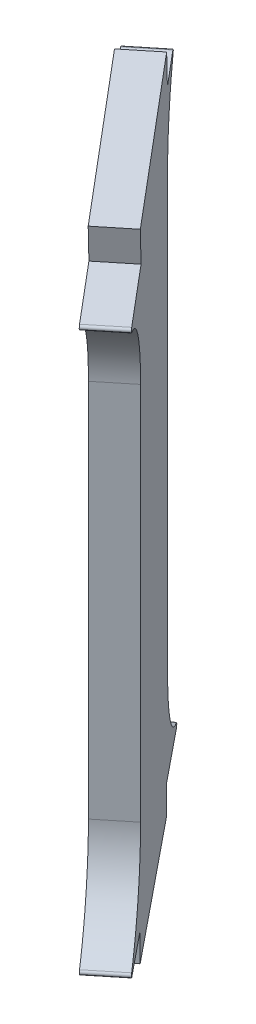
ISO-10303-21;
HEADER;
FILE_DESCRIPTION(('STEP AP214'),'2;1');
FILE_NAME('part.step','',(''),(''),'','','');
FILE_SCHEMA(('AUTOMOTIVE_DESIGN { 1 0 10303 214 1 1 1 1 }'));
ENDSEC;
DATA;
#1=APPLICATION_CONTEXT('core data for automotive mechanical design processes');
#2=APPLICATION_PROTOCOL_DEFINITION('international standard','automotive_design',2000,#1);
#3=PRODUCT_CONTEXT('',#1,'mechanical');
#4=PRODUCT('Part','Part','',(#3));
#5=PRODUCT_RELATED_PRODUCT_CATEGORY('part','',(#4));
#6=PRODUCT_DEFINITION_FORMATION('','',#4);
#7=PRODUCT_DEFINITION_CONTEXT('part definition',#1,'design');
#8=PRODUCT_DEFINITION('design','',#6,#7);
#9=PRODUCT_DEFINITION_SHAPE('','',#8);
#10=(LENGTH_UNIT() NAMED_UNIT(*) SI_UNIT(.MILLI.,.METRE.));
#11=(NAMED_UNIT(*) PLANE_ANGLE_UNIT() SI_UNIT($,.RADIAN.));
#12=(NAMED_UNIT(*) SI_UNIT($,.STERADIAN.) SOLID_ANGLE_UNIT());
#13=UNCERTAINTY_MEASURE_WITH_UNIT(LENGTH_MEASURE(1.E-05),#10,'distance_accuracy_value','');
#14=(GEOMETRIC_REPRESENTATION_CONTEXT(3) GLOBAL_UNCERTAINTY_ASSIGNED_CONTEXT((#13)) GLOBAL_UNIT_ASSIGNED_CONTEXT((#10,
#11,#12)) REPRESENTATION_CONTEXT('',''));
#15=CARTESIAN_POINT('',(0.,0.,0.));
#16=DIRECTION('',(0.,0.,1.));
#17=DIRECTION('',(1.,0.,0.));
#18=AXIS2_PLACEMENT_3D('',#15,#16,#17);
#19=CARTESIAN_POINT('',(-103.294328172004,60.7540029787998,-26.7976457365978));
#20=DIRECTION('',(-0.776187884580817,0.,0.630501679482264));
#21=DIRECTION('',(0.,1.,0.));
#22=AXIS2_PLACEMENT_3D('',#19,#20,#21);
#23=ELLIPSE('',#22,10.0702795953244,10.);
#24=DIRECTION('',(-0.776187884580817,0.,0.630501679482264));
#25=VECTOR('',#24,1.);
#26=SURFACE_OF_LINEAR_EXTRUSION('',#23,#25);
#27=CARTESIAN_POINT('',(-106.399079710327,60.7540029787998,-24.2756390186688));
#28=DIRECTION('',(-0.776187884580817,0.,0.630501679482264));
#29=DIRECTION('',(0.,1.,0.));
#30=AXIS2_PLACEMENT_3D('',#27,#28,#29);
#31=ELLIPSE('',#30,10.0702795953244,10.);
#32=CARTESIAN_POINT('',(-100.094062915505,60.754002978797,-16.5137601728606));
#33=VERTEX_POINT('',#32);
#34=CARTESIAN_POINT('',(-102.677703872655,68.8831263557012,-19.6943874008383));
#35=VERTEX_POINT('',#34);
#36=EDGE_CURVE('E186',#33,#35,#31,.T.);
#37=ORIENTED_EDGE('',*,*,#36,.T.);
#38=DIRECTION('',(-0.776187884580817,0.,0.630501679482264));
#39=VECTOR('',#38,1.);
#40=CARTESIAN_POINT('',(-102.677703872655,68.8831263557012,-19.6943874008383));
#41=LINE('',#40,#39);
#42=CARTESIAN_POINT('',(-99.572952334332,68.8831263557012,-22.2163941187674));
#43=VERTEX_POINT('',#42);
#44=EDGE_CURVE('E45',#35,#43,#41,.F.);
#45=ORIENTED_EDGE('',*,*,#44,.T.);
#46=CARTESIAN_POINT('',(-96.9893113771815,60.754002978797,-19.0357668907898));
#47=VERTEX_POINT('',#46);
#48=EDGE_CURVE('E228',#47,#43,#23,.T.);
#49=ORIENTED_EDGE('',*,*,#48,.F.);
#50=DIRECTION('',(0.776187884580817,0.,-0.630501679482264));
#51=VECTOR('',#50,1.);
#52=CARTESIAN_POINT('',(-96.9893113771815,60.754002978797,-19.0357668907898));
#53=LINE('',#52,#51);
#54=EDGE_CURVE('E310',#33,#47,#53,.T.);
#55=ORIENTED_EDGE('',*,*,#54,.F.);
#56=EDGE_LOOP('',(#37,#45,#49,#55));
#57=FACE_BOUND('',#56,.T.);
#58=ADVANCED_FACE('F37',(#57),#26,.F.);
#59=CARTESIAN_POINT('',(-78.0742609927137,54.9056720327663,4.24986964663486));
#60=DIRECTION('',(-0.776187884580817,0.,0.630501679482264));
#61=DIRECTION('',(0.,-1.,0.));
#62=AXIS2_PLACEMENT_3D('',#59,#60,#61);
#63=ELLIPSE('',#62,10.0702795953244,10.);
#64=DIRECTION('',(-0.776187884580817,0.,0.630501679482264));
#65=VECTOR('',#64,1.);
#66=SURFACE_OF_LINEAR_EXTRUSION('',#63,#65);
#67=CARTESIAN_POINT('',(-80.1944561355512,64.3895110863629,1.63977385090458));
#68=VERTEX_POINT('',#67);
#69=CARTESIAN_POINT('',(-84.3792777875361,54.9056720327599,-3.51200919917346));
#70=VERTEX_POINT('',#69);
#71=EDGE_CURVE('E331',#68,#70,#63,.T.);
#72=ORIENTED_EDGE('',*,*,#71,.F.);
#73=DIRECTION('',(-0.776187884580817,0.,0.630501679482264));
#74=VECTOR('',#73,1.);
#75=CARTESIAN_POINT('',(-80.1944561355512,64.3895110863629,1.63977385090458));
#76=LINE('',#75,#74);
#77=CARTESIAN_POINT('',(-83.2992076738744,64.3895110863629,4.16178056883363));
#78=VERTEX_POINT('',#77);
#79=EDGE_CURVE('E194',#68,#78,#76,.T.);
#80=ORIENTED_EDGE('',*,*,#79,.T.);
#81=CARTESIAN_POINT('',(-81.179012531037,54.9056720327663,6.77187636456391));
#82=DIRECTION('',(-0.776187884580817,0.,0.630501679482264));
#83=DIRECTION('',(0.,-1.,0.));
#84=AXIS2_PLACEMENT_3D('',#81,#82,#83);
#85=ELLIPSE('',#84,10.0702795953244,10.);
#86=CARTESIAN_POINT('',(-87.4840293258596,54.9056720327599,-0.990002481244256));
#87=VERTEX_POINT('',#86);
#88=EDGE_CURVE('E329',#78,#87,#85,.T.);
#89=ORIENTED_EDGE('',*,*,#88,.T.);
#90=DIRECTION('',(0.776187884580817,0.,-0.630501679482264));
#91=VECTOR('',#90,1.);
#92=CARTESIAN_POINT('',(-84.3792777875361,54.9056720327599,-3.51200919917346));
#93=LINE('',#92,#91);
#94=EDGE_CURVE('E360',#87,#70,#93,.T.);
#95=ORIENTED_EDGE('',*,*,#94,.T.);
#96=EDGE_LOOP('',(#72,#80,#89,#95));
#97=FACE_BOUND('',#96,.T.);
#98=ADVANCED_FACE('F237',(#97),#66,.F.);
#99=CARTESIAN_POINT('',(-192.,4.1,-136.));
#100=DIRECTION('',(0.,-1.,0.));
#101=DIRECTION('',(0.630501679482264,0.,0.776187884580817));
#102=AXIS2_PLACEMENT_3D('',#99,#100,#101);
#103=PLANE('',#102);
#104=DIRECTION('',(0.630501679482264,0.,0.776187884580817));
#105=VECTOR('',#104,1.);
#106=CARTESIAN_POINT('',(-195.104751538323,4.1,-133.477993282071));
#107=LINE('',#106,#105);
#108=CARTESIAN_POINT('',(-104.220424971317,4.1,-21.5935757218777));
#109=VERTEX_POINT('',#108);
#110=CARTESIAN_POINT('',(-99.5657749961663,4.1,-15.8634039630284));
#111=VERTEX_POINT('',#110);
#112=EDGE_CURVE('E350',#109,#111,#107,.T.);
#113=ORIENTED_EDGE('',*,*,#112,.F.);
#114=DIRECTION('',(-0.776187884580817,0.,0.630501679482264));
#115=VECTOR('',#114,1.);
#116=CARTESIAN_POINT('',(-101.115673432994,4.1,-24.1155824398067));
#117=LINE('',#116,#115);
#118=CARTESIAN_POINT('',(-101.115673432994,4.1,-24.1155824398067));
#119=VERTEX_POINT('',#118);
#120=EDGE_CURVE('E274',#109,#119,#117,.F.);
#121=ORIENTED_EDGE('',*,*,#120,.T.);
#122=DIRECTION('',(0.630501679482264,0.,0.776187884580817));
#123=VECTOR('',#122,1.);
#124=CARTESIAN_POINT('',(-192.,4.1,-136.));
#125=LINE('',#124,#123);
#126=CARTESIAN_POINT('',(-96.4610234578431,4.1,-18.3854106809574));
#127=VERTEX_POINT('',#126);
#128=EDGE_CURVE('E220',#119,#127,#125,.T.);
#129=ORIENTED_EDGE('',*,*,#128,.T.);
#130=DIRECTION('',(0.776187884580817,0.,-0.630501679482264));
#131=VECTOR('',#130,1.);
#132=CARTESIAN_POINT('',(-96.4610234578431,4.1,-18.3854106809574));
#133=LINE('',#132,#131);
#134=EDGE_CURVE('E195',#111,#127,#133,.T.);
#135=ORIENTED_EDGE('',*,*,#134,.F.);
#136=EDGE_LOOP('',(#113,#121,#129,#135));
#137=FACE_BOUND('',#136,.T.);
#138=ADVANCED_FACE('F247',(#137),#103,.T.);
#139=CARTESIAN_POINT('',(-103.294328172004,14.00000000001,-26.7976457365978));
#140=DIRECTION('',(-0.776187884580817,0.,0.630501679482264));
#141=DIRECTION('',(0.630501679482264,0.,0.776187884580817));
#142=AXIS2_PLACEMENT_3D('',#139,#140,#141);
#143=CYLINDRICAL_SURFACE('',#142,10.);
#144=CARTESIAN_POINT('',(-103.294328172004,14.00000000001,-26.7976457365978));
#145=DIRECTION('',(-0.776187884580817,0.,0.630501679482264));
#146=DIRECTION('',(0.630501679482264,0.,0.776187884580817));
#147=AXIS2_PLACEMENT_3D('',#144,#145,#146);
#148=CIRCLE('',#147,10.);
#149=CARTESIAN_POINT('',(-101.168811353457,4.58536585365878,-24.1809986177772));
#150=VERTEX_POINT('',#149);
#151=CARTESIAN_POINT('',(-96.9893113771815,14.00000000001,-19.0357668907898));
#152=VERTEX_POINT('',#151);
#153=EDGE_CURVE('E222',#150,#152,#148,.T.);
#154=ORIENTED_EDGE('',*,*,#153,.F.);
#155=DIRECTION('',(-0.776187884580817,0.,0.630501679482264));
#156=VECTOR('',#155,1.);
#157=CARTESIAN_POINT('',(-101.168811353457,4.58536585365878,-24.1809986177772));
#158=LINE('',#157,#156);
#159=CARTESIAN_POINT('',(-104.273562891781,4.58536585365878,-21.6589918998482));
#160=VERTEX_POINT('',#159);
#161=EDGE_CURVE('E272',#150,#160,#158,.T.);
#162=ORIENTED_EDGE('',*,*,#161,.T.);
#163=CARTESIAN_POINT('',(-106.399079710327,14.00000000001,-24.2756390186688));
#164=DIRECTION('',(-0.776187884580817,0.,0.630501679482264));
#165=DIRECTION('',(0.630501679482264,0.,0.776187884580817));
#166=AXIS2_PLACEMENT_3D('',#163,#164,#165);
#167=CIRCLE('',#166,10.);
#168=CARTESIAN_POINT('',(-100.094062915505,14.00000000001,-16.5137601728606));
#169=VERTEX_POINT('',#168);
#170=EDGE_CURVE('E348',#160,#169,#167,.T.);
#171=ORIENTED_EDGE('',*,*,#170,.T.);
#172=DIRECTION('',(0.776187884580817,0.,-0.630501679482264));
#173=VECTOR('',#172,1.);
#174=CARTESIAN_POINT('',(-96.9893113771815,14.00000000001,-19.0357668907898));
#175=LINE('',#174,#173);
#176=EDGE_CURVE('E308',#169,#152,#175,.T.);
#177=ORIENTED_EDGE('',*,*,#176,.T.);
#178=EDGE_LOOP('',(#154,#162,#171,#177));
#179=FACE_BOUND('',#178,.T.);
#180=ADVANCED_FACE('F243',(#179),#143,.F.);
#181=CARTESIAN_POINT('',(-96.9893113771815,500000.,-19.0357668907898));
#182=DIRECTION('',(-0.630501679482264,0.,-0.776187884580817));
#183=DIRECTION('',(0.,-1.,0.));
#184=AXIS2_PLACEMENT_3D('',#181,#182,#183);
#185=PLANE('',#184);
#186=ORIENTED_EDGE('',*,*,#176,.F.);
#187=DIRECTION('',(0.,1.,0.));
#188=VECTOR('',#187,1.);
#189=CARTESIAN_POINT('',(-100.094062915505,4.,-16.5137601728606));
#190=LINE('',#189,#188);
#191=EDGE_CURVE('E311',#33,#169,#190,.F.);
#192=ORIENTED_EDGE('',*,*,#191,.F.);
#193=ORIENTED_EDGE('',*,*,#54,.T.);
#194=DIRECTION('',(0.,-1.,0.));
#195=VECTOR('',#194,1.);
#196=CARTESIAN_POINT('',(-96.9893113771815,500000.,-19.0357668907898));
#197=LINE('',#196,#195);
#198=EDGE_CURVE('E225',#47,#152,#197,.T.);
#199=ORIENTED_EDGE('',*,*,#198,.T.);
#200=EDGE_LOOP('',(#186,#192,#193,#199));
#201=FACE_BOUND('',#200,.T.);
#202=ADVANCED_FACE('F240',(#201),#185,.T.);
#203=CARTESIAN_POINT('',(-104.726730982296,-16.2379698804638,-28.5610251904013));
#204=DIRECTION('',(-0.623868762401143,0.144670153472482,-0.768022339515144));
#205=DIRECTION('',(-0.0912147747353569,-0.989479937489512,-0.112291220385788));
#206=AXIS2_PLACEMENT_3D('',#203,#204,#205);
#207=PLANE('',#206);
#208=DIRECTION('',(-0.0912147747353569,-0.989479937489512,-0.112291220385788));
#209=VECTOR('',#208,1.);
#210=CARTESIAN_POINT('',(-104.726730982296,-16.2379698804638,-28.5610251904013));
#211=LINE('',#210,#209);
#212=CARTESIAN_POINT('',(-96.5576277464683,72.3788554374026,-18.5043367375716));
#213=VERTEX_POINT('',#212);
#214=CARTESIAN_POINT('',(-96.8933150025935,68.7373861012075,-18.917589215228));
#215=VERTEX_POINT('',#214);
#216=EDGE_CURVE('E199',#213,#215,#211,.T.);
#217=ORIENTED_EDGE('',*,*,#216,.T.);
#218=DIRECTION('',(0.77618788458082,0.,-0.63050167948226));
#219=VECTOR('',#218,1.);
#220=CARTESIAN_POINT('',(-99.9980665409168,68.7373861012075,-16.3955824972989));
#221=LINE('',#220,#219);
#222=CARTESIAN_POINT('',(-99.9980665409168,68.7373861012075,-16.3955824972989));
#223=VERTEX_POINT('',#222);
#224=EDGE_CURVE('E192',#223,#215,#221,.T.);
#225=ORIENTED_EDGE('',*,*,#224,.F.);
#226=DIRECTION('',(-0.0912147747353569,-0.989479937489512,-0.112291220385788));
#227=VECTOR('',#226,1.);
#228=CARTESIAN_POINT('',(-107.831482520619,-16.2379698804638,-26.0390184724723));
#229=LINE('',#228,#227);
#230=CARTESIAN_POINT('',(-99.6623792847916,72.3788554374026,-15.9823300196426));
#231=VERTEX_POINT('',#230);
#232=EDGE_CURVE('E175',#231,#223,#229,.T.);
#233=ORIENTED_EDGE('',*,*,#232,.F.);
#234=DIRECTION('',(0.776187884580817,0.,-0.630501679482264));
#235=VECTOR('',#234,1.);
#236=CARTESIAN_POINT('',(-96.5576277464683,72.3788554374026,-18.5043367375716));
#237=LINE('',#236,#235);
#238=EDGE_CURVE('E312',#231,#213,#237,.T.);
#239=ORIENTED_EDGE('',*,*,#238,.T.);
#240=EDGE_LOOP('',(#217,#225,#233,#239));
#241=FACE_BOUND('',#240,.T.);
#242=ADVANCED_FACE('F197',(#241),#207,.T.);
#243=CARTESIAN_POINT('',(-96.5576277464683,72.3788554374026,-18.5043367375716));
#244=DIRECTION('',(-0.0912147747353561,-0.989479937489512,-0.112291220385787));
#245=DIRECTION('',(0.623868762401143,-0.144670153472481,0.768022339515144));
#246=AXIS2_PLACEMENT_3D('',#243,#244,#245);
#247=PLANE('',#246);
#248=ORIENTED_EDGE('',*,*,#238,.F.);
#249=DIRECTION('',(0.623868762401143,-0.144670153472481,0.768022339515144));
#250=VECTOR('',#249,1.);
#251=CARTESIAN_POINT('',(-99.6623792847916,72.3788554374026,-15.9823300196426));
#252=LINE('',#251,#250);
#253=CARTESIAN_POINT('',(-87.3721646654891,69.5288534139947,-0.852289931194294));
#254=VERTEX_POINT('',#253);
#255=EDGE_CURVE('E183',#231,#254,#252,.T.);
#256=ORIENTED_EDGE('',*,*,#255,.T.);
#257=DIRECTION('',(0.776187884580817,0.,-0.630501679482264));
#258=VECTOR('',#257,1.);
#259=CARTESIAN_POINT('',(-84.2674131271659,69.5288534139947,-3.37429664912337));
#260=LINE('',#259,#258);
#261=CARTESIAN_POINT('',(-84.2674131271659,69.5288534139947,-3.37429664912337));
#262=VERTEX_POINT('',#261);
#263=EDGE_CURVE('E315',#254,#262,#260,.T.);
#264=ORIENTED_EDGE('',*,*,#263,.T.);
#265=DIRECTION('',(0.623868762401143,-0.144670153472481,0.768022339515144));
#266=VECTOR('',#265,1.);
#267=CARTESIAN_POINT('',(-96.5576277464683,72.3788554374026,-18.5043367375716));
#268=LINE('',#267,#266);
#269=EDGE_CURVE('E365',#213,#262,#268,.T.);
#270=ORIENTED_EDGE('',*,*,#269,.F.);
#271=EDGE_LOOP('',(#248,#256,#264,#270));
#272=FACE_BOUND('',#271,.T.);
#273=ADVANCED_FACE('F364',(#272),#247,.F.);
#274=CARTESIAN_POINT('',(-92.4365163629929,-19.0879719038713,-13.4309851019528));
#275=DIRECTION('',(0.623868762401143,-0.14467015347248,0.768022339515144));
#276=DIRECTION('',(0.0912147747353555,0.989479937489512,0.112291220385786));
#277=AXIS2_PLACEMENT_3D('',#274,#275,#276);
#278=PLANE('',#277);
#279=ORIENTED_EDGE('',*,*,#263,.F.);
#280=DIRECTION('',(0.0912147747353555,0.989479937489512,0.112291220385786));
#281=VECTOR('',#280,1.);
#282=CARTESIAN_POINT('',(-95.5412679013161,-19.0879719038713,-10.9089783840238));
#283=LINE('',#282,#281);
#284=CARTESIAN_POINT('',(-87.7078519216143,65.8873840777996,-1.26554240885064));
#285=VERTEX_POINT('',#284);
#286=EDGE_CURVE('E338',#285,#254,#283,.T.);
#287=ORIENTED_EDGE('',*,*,#286,.F.);
#288=DIRECTION('',(-0.776187884580815,0.,0.630501679482266));
#289=VECTOR('',#288,1.);
#290=CARTESIAN_POINT('',(-84.603100383291,65.8873840777996,-3.7875491267797));
#291=LINE('',#290,#289);
#292=CARTESIAN_POINT('',(-84.603100383291,65.8873840777996,-3.7875491267797));
#293=VERTEX_POINT('',#292);
#294=EDGE_CURVE('E203',#293,#285,#291,.T.);
#295=ORIENTED_EDGE('',*,*,#294,.F.);
#296=DIRECTION('',(0.0912147747353555,0.989479937489512,0.112291220385786));
#297=VECTOR('',#296,1.);
#298=CARTESIAN_POINT('',(-92.4365163629929,-19.0879719038713,-13.4309851019528));
#299=LINE('',#298,#297);
#300=EDGE_CURVE('E369',#293,#262,#299,.T.);
#301=ORIENTED_EDGE('',*,*,#300,.T.);
#302=EDGE_LOOP('',(#279,#287,#295,#301));
#303=FACE_BOUND('',#302,.T.);
#304=ADVANCED_FACE('F371',(#303),#278,.T.);
#305=CARTESIAN_POINT('',(-84.3792777875361,500000.,-3.51200919917346));
#306=DIRECTION('',(-0.630501679482264,0.,-0.776187884580817));
#307=DIRECTION('',(0.,-1.,0.));
#308=AXIS2_PLACEMENT_3D('',#305,#306,#307);
#309=PLANE('',#308);
#310=ORIENTED_EDGE('',*,*,#94,.F.);
#311=DIRECTION('',(0.,1.,0.));
#312=VECTOR('',#311,1.);
#313=CARTESIAN_POINT('',(-87.4840293258596,4.,-0.990002481244256));
#314=LINE('',#313,#312);
#315=CARTESIAN_POINT('',(-87.4840293258596,14.00000000001,-0.990002481244256));
#316=VERTEX_POINT('',#315);
#317=EDGE_CURVE('E337',#87,#316,#314,.F.);
#318=ORIENTED_EDGE('',*,*,#317,.T.);
#319=DIRECTION('',(0.776187884580817,0.,-0.630501679482264));
#320=VECTOR('',#319,1.);
#321=CARTESIAN_POINT('',(-84.3792777875361,14.00000000001,-3.51200919917346));
#322=LINE('',#321,#320);
#323=CARTESIAN_POINT('',(-84.3792777875361,14.00000000001,-3.51200919917346));
#324=VERTEX_POINT('',#323);
#325=EDGE_CURVE('E358',#316,#324,#322,.T.);
#326=ORIENTED_EDGE('',*,*,#325,.T.);
#327=DIRECTION('',(0.,-1.,0.));
#328=VECTOR('',#327,1.);
#329=CARTESIAN_POINT('',(-84.3792777875361,500000.,-3.51200919917346));
#330=LINE('',#329,#328);
#331=EDGE_CURVE('E373',#70,#324,#330,.T.);
#332=ORIENTED_EDGE('',*,*,#331,.F.);
#333=EDGE_LOOP('',(#310,#318,#326,#332));
#334=FACE_BOUND('',#333,.T.);
#335=ADVANCED_FACE('F382',(#334),#309,.F.);
#336=CARTESIAN_POINT('',(-78.0742609927136,14.00000000001,4.24986964663486));
#337=DIRECTION('',(-0.776187884580817,0.,0.630501679482264));
#338=DIRECTION('',(0.630501679482264,0.,0.776187884580817));
#339=AXIS2_PLACEMENT_3D('',#336,#337,#338);
#340=CYLINDRICAL_SURFACE('',#339,10.);
#341=CARTESIAN_POINT('',(-81.1790125310369,14.00000000001,6.7718763645639));
#342=DIRECTION('',(-0.776187884580817,0.,0.630501679482264));
#343=DIRECTION('',(0.630501679482264,0.,0.776187884580817));
#344=AXIS2_PLACEMENT_3D('',#341,#342,#343);
#345=CIRCLE('',#344,10.);
#346=CARTESIAN_POINT('',(-83.3045293495838,4.58536585365878,4.15522924574331));
#347=VERTEX_POINT('',#346);
#348=EDGE_CURVE('E340',#316,#347,#345,.T.);
#349=ORIENTED_EDGE('',*,*,#348,.T.);
#350=DIRECTION('',(-0.776187884580817,0.,0.630501679482264));
#351=VECTOR('',#350,1.);
#352=CARTESIAN_POINT('',(-80.1997778112605,4.58536585365878,1.63322252781426));
#353=LINE('',#352,#351);
#354=CARTESIAN_POINT('',(-80.1997778112605,4.58536585365878,1.63322252781426));
#355=VERTEX_POINT('',#354);
#356=EDGE_CURVE('E294',#347,#355,#353,.F.);
#357=ORIENTED_EDGE('',*,*,#356,.T.);
#358=CARTESIAN_POINT('',(-78.0742609927136,14.00000000001,4.24986964663486));
#359=DIRECTION('',(-0.776187884580817,0.,0.630501679482264));
#360=DIRECTION('',(0.630501679482264,0.,0.776187884580817));
#361=AXIS2_PLACEMENT_3D('',#358,#359,#360);
#362=CIRCLE('',#361,10.);
#363=EDGE_CURVE('E521',#324,#355,#362,.T.);
#364=ORIENTED_EDGE('',*,*,#363,.F.);
#365=ORIENTED_EDGE('',*,*,#325,.F.);
#366=EDGE_LOOP('',(#349,#357,#364,#365));
#367=FACE_BOUND('',#366,.T.);
#368=ADVANCED_FACE('F433',(#367),#340,.F.);
#369=CARTESIAN_POINT('',(-84.1728260475065,4.1,-3.25785390573569));
#370=VERTEX_POINT('',#369);
#371=CARTESIAN_POINT('',(-80.2529157317242,4.1,1.56780634984374));
#372=VERTEX_POINT('',#371);
#373=EDGE_CURVE('E223',#370,#372,#125,.T.);
#374=ORIENTED_EDGE('',*,*,#373,.T.);
#375=DIRECTION('',(-0.776187884580817,0.,0.630501679482264));
#376=VECTOR('',#375,1.);
#377=CARTESIAN_POINT('',(-80.2529157317242,4.1,1.56780634984374));
#378=LINE('',#377,#376);
#379=CARTESIAN_POINT('',(-83.3576672700474,4.1,4.08981306777279));
#380=VERTEX_POINT('',#379);
#381=EDGE_CURVE('E297',#372,#380,#378,.T.);
#382=ORIENTED_EDGE('',*,*,#381,.T.);
#383=DIRECTION('',(0.630501679482264,0.,0.776187884580817));
#384=VECTOR('',#383,1.);
#385=CARTESIAN_POINT('',(-195.104751538323,4.1,-133.477993282071));
#386=LINE('',#385,#384);
#387=CARTESIAN_POINT('',(-87.2775775858298,4.1,-0.735847187806615));
#388=VERTEX_POINT('',#387);
#389=EDGE_CURVE('E530',#388,#380,#386,.T.);
#390=ORIENTED_EDGE('',*,*,#389,.F.);
#391=DIRECTION('',(0.776187884580817,0.,-0.630501679482264));
#392=VECTOR('',#391,1.);
#393=CARTESIAN_POINT('',(-84.1728260475065,4.1,-3.25785390573569));
#394=LINE('',#393,#392);
#395=EDGE_CURVE('E356',#388,#370,#394,.T.);
#396=ORIENTED_EDGE('',*,*,#395,.T.);
#397=EDGE_LOOP('',(#374,#382,#390,#396));
#398=FACE_BOUND('',#397,.T.);
#399=ADVANCED_FACE('F409',(#398),#103,.T.);
#400=CARTESIAN_POINT('',(-84.1728260475066,4.,-3.25785390573571));
#401=DIRECTION('',(0.630501679482264,0.,0.776187884580817));
#402=DIRECTION('',(0.,1.,0.));
#403=AXIS2_PLACEMENT_3D('',#400,#401,#402);
#404=PLANE('',#403);
#405=ORIENTED_EDGE('',*,*,#395,.F.);
#406=DIRECTION('',(0.,1.,0.));
#407=VECTOR('',#406,1.);
#408=CARTESIAN_POINT('',(-87.2775775858298,4.,-0.735847187806615));
#409=LINE('',#408,#407);
#410=CARTESIAN_POINT('',(-87.2775775858298,1.,-0.735847187806615));
#411=VERTEX_POINT('',#410);
#412=EDGE_CURVE('E217',#411,#388,#409,.T.);
#413=ORIENTED_EDGE('',*,*,#412,.F.);
#414=DIRECTION('',(0.776187884580817,0.,-0.630501679482264));
#415=VECTOR('',#414,1.);
#416=CARTESIAN_POINT('',(-84.1728260475065,1.,-3.25785390573566));
#417=LINE('',#416,#415);
#418=CARTESIAN_POINT('',(-84.1728260475065,1.,-3.25785390573566));
#419=VERTEX_POINT('',#418);
#420=EDGE_CURVE('E322',#411,#419,#417,.T.);
#421=ORIENTED_EDGE('',*,*,#420,.T.);
#422=DIRECTION('',(0.,1.,0.));
#423=VECTOR('',#422,1.);
#424=CARTESIAN_POINT('',(-84.1728260475066,4.,-3.25785390573571));
#425=LINE('',#424,#423);
#426=EDGE_CURVE('E323',#419,#370,#425,.T.);
#427=ORIENTED_EDGE('',*,*,#426,.T.);
#428=EDGE_LOOP('',(#405,#413,#421,#427));
#429=FACE_BOUND('',#428,.T.);
#430=ADVANCED_FACE('F446',(#429),#404,.T.);
#431=CARTESIAN_POINT('',(-192.,1.,-136.));
#432=DIRECTION('',(0.,-1.,0.));
#433=DIRECTION('',(0.630501679482264,0.,0.776187884580817));
#434=AXIS2_PLACEMENT_3D('',#431,#432,#433);
#435=PLANE('',#434);
#436=ORIENTED_EDGE('',*,*,#420,.F.);
#437=DIRECTION('',(0.630501679482264,0.,0.776187884580817));
#438=VECTOR('',#437,1.);
#439=CARTESIAN_POINT('',(-195.104751538323,1.,-133.477993282071));
#440=LINE('',#439,#438);
#441=CARTESIAN_POINT('',(-99.5657749961663,1.,-15.8634039630284));
#442=VERTEX_POINT('',#441);
#443=EDGE_CURVE('E212',#442,#411,#440,.T.);
#444=ORIENTED_EDGE('',*,*,#443,.F.);
#445=DIRECTION('',(0.776187884580817,0.,-0.630501679482264));
#446=VECTOR('',#445,1.);
#447=CARTESIAN_POINT('',(-96.4610234578431,1.,-18.3854106809574));
#448=LINE('',#447,#446);
#449=CARTESIAN_POINT('',(-96.4610234578431,1.,-18.3854106809574));
#450=VERTEX_POINT('',#449);
#451=EDGE_CURVE('E321',#442,#450,#448,.T.);
#452=ORIENTED_EDGE('',*,*,#451,.T.);
#453=DIRECTION('',(0.630501679482264,0.,0.776187884580817));
#454=VECTOR('',#453,1.);
#455=CARTESIAN_POINT('',(-192.,1.,-136.));
#456=LINE('',#455,#454);
#457=EDGE_CURVE('E213',#450,#419,#456,.T.);
#458=ORIENTED_EDGE('',*,*,#457,.T.);
#459=EDGE_LOOP('',(#436,#444,#452,#458));
#460=FACE_BOUND('',#459,.T.);
#461=ADVANCED_FACE('F253',(#460),#435,.T.);
#462=CARTESIAN_POINT('',(-96.4610234578431,4.,-18.3854106809574));
#463=DIRECTION('',(-0.630501679482264,0.,-0.776187884580817));
#464=DIRECTION('',(0.,-1.,0.));
#465=AXIS2_PLACEMENT_3D('',#462,#463,#464);
#466=PLANE('',#465);
#467=DIRECTION('',(0.,1.,0.));
#468=VECTOR('',#467,1.);
#469=CARTESIAN_POINT('',(-99.5657749961663,4.,-15.8634039630284));
#470=LINE('',#469,#468);
#471=EDGE_CURVE('E352',#111,#442,#470,.F.);
#472=ORIENTED_EDGE('',*,*,#471,.F.);
#473=ORIENTED_EDGE('',*,*,#134,.T.);
#474=DIRECTION('',(0.,-1.,0.));
#475=VECTOR('',#474,1.);
#476=CARTESIAN_POINT('',(-96.4610234578431,4.,-18.3854106809574));
#477=LINE('',#476,#475);
#478=EDGE_CURVE('E216',#127,#450,#477,.T.);
#479=ORIENTED_EDGE('',*,*,#478,.T.);
#480=ORIENTED_EDGE('',*,*,#451,.F.);
#481=EDGE_LOOP('',(#472,#473,#479,#480));
#482=FACE_BOUND('',#481,.T.);
#483=ADVANCED_FACE('F249',(#482),#466,.T.);
#484=CARTESIAN_POINT('',(-192.,4.,-136.));
#485=DIRECTION('',(-0.776187884580817,0.,0.630501679482264));
#486=DIRECTION('',(0.630501679482264,0.,0.776187884580817));
#487=AXIS2_PLACEMENT_3D('',#484,#485,#486);
#488=PLANE('',#487);
#489=DIRECTION('',(-0.623868762401141,0.144670153472483,-0.768022339515145));
#490=VECTOR('',#489,1.);
#491=CARTESIAN_POINT('',(-78.1123384964128,64.3822285468287,4.20299380473288));
#492=LINE('',#491,#490);
#493=CARTESIAN_POINT('',(-80.2249873188489,64.8721348344892,1.60218801196269));
#494=VERTEX_POINT('',#493);
#495=EDGE_CURVE('E200',#494,#293,#492,.T.);
#496=ORIENTED_EDGE('',*,*,#495,.F.);
#497=CARTESIAN_POINT('',(-80.2477910125327,64.6247648501168,1.57411520686623));
#498=DIRECTION('',(-0.776187884580817,0.,0.630501679482264));
#499=DIRECTION('',(0.630501679482264,0.,0.776187884580817));
#500=AXIS2_PLACEMENT_3D('',#497,#498,#499);
#501=CIRCLE('',#500,0.25);
#502=EDGE_CURVE('E292',#494,#68,#501,.F.);
#503=ORIENTED_EDGE('',*,*,#502,.T.);
#504=ORIENTED_EDGE('',*,*,#71,.T.);
#505=ORIENTED_EDGE('',*,*,#331,.T.);
#506=ORIENTED_EDGE('',*,*,#363,.T.);
#507=CARTESIAN_POINT('',(-80.2529157317242,4.35,1.56780634984374));
#508=DIRECTION('',(-0.776187884580817,0.,0.630501679482264));
#509=DIRECTION('',(0.630501679482264,0.,0.776187884580817));
#510=AXIS2_PLACEMENT_3D('',#507,#508,#509);
#511=CIRCLE('',#510,0.25);
#512=EDGE_CURVE('E290',#355,#372,#511,.F.);
#513=ORIENTED_EDGE('',*,*,#512,.T.);
#514=ORIENTED_EDGE('',*,*,#373,.F.);
#515=ORIENTED_EDGE('',*,*,#426,.F.);
#516=ORIENTED_EDGE('',*,*,#457,.F.);
#517=ORIENTED_EDGE('',*,*,#478,.F.);
#518=ORIENTED_EDGE('',*,*,#128,.F.);
#519=CARTESIAN_POINT('',(-101.115673432994,4.35,-24.1155824398067));
#520=DIRECTION('',(-0.776187884580817,0.,0.630501679482264));
#521=DIRECTION('',(0.630501679482264,0.,0.776187884580817));
#522=AXIS2_PLACEMENT_3D('',#519,#520,#521);
#523=CIRCLE('',#522,0.25);
#524=EDGE_CURVE('E60',#119,#150,#523,.F.);
#525=ORIENTED_EDGE('',*,*,#524,.T.);
#526=ORIENTED_EDGE('',*,*,#153,.T.);
#527=ORIENTED_EDGE('',*,*,#198,.F.);
#528=ORIENTED_EDGE('',*,*,#48,.T.);
#529=CARTESIAN_POINT('',(-99.4794934340865,69.0844421228737,-22.101340236379));
#530=DIRECTION('',(-0.776187884580817,0.,0.630501679482264));
#531=DIRECTION('',(0.630501679482264,0.,0.776187884580817));
#532=AXIS2_PLACEMENT_3D('',#529,#530,#531);
#533=CIRCLE('',#532,0.25);
#534=CARTESIAN_POINT('',(-99.4566897404027,69.331812107246,-22.0732674312826));
#535=VERTEX_POINT('',#534);
#536=EDGE_CURVE('E52',#43,#535,#533,.F.);
#537=ORIENTED_EDGE('',*,*,#536,.T.);
#538=DIRECTION('',(-0.623868762401145,0.144670153472484,-0.768022339515142));
#539=VECTOR('',#538,1.);
#540=CARTESIAN_POINT('',(-96.8933150025935,68.7373861012075,-18.917589215228));
#541=LINE('',#540,#539);
#542=EDGE_CURVE('E201',#215,#535,#541,.T.);
#543=ORIENTED_EDGE('',*,*,#542,.F.);
#544=ORIENTED_EDGE('',*,*,#216,.F.);
#545=ORIENTED_EDGE('',*,*,#269,.T.);
#546=ORIENTED_EDGE('',*,*,#300,.F.);
#547=EDGE_LOOP('',(#496,#503,#504,#505,#506,#513,#514,#515,#516,#517,#518,#525,#526,#527,#528,
#537,#543,#544,#545,#546));
#548=FACE_BOUND('',#547,.T.);
#549=ADVANCED_FACE('F252',(#548),#488,.F.);
#550=CARTESIAN_POINT('',(-195.104751538323,4.,-133.477993282071));
#551=DIRECTION('',(-0.776187884580817,0.,0.630501679482264));
#552=DIRECTION('',(0.630501679482264,0.,0.776187884580817));
#553=AXIS2_PLACEMENT_3D('',#550,#551,#552);
#554=PLANE('',#553);
#555=ORIENTED_EDGE('',*,*,#88,.F.);
#556=CARTESIAN_POINT('',(-83.352542550856,64.6247648501168,4.09612192479527));
#557=DIRECTION('',(-0.776187884580817,0.,0.630501679482264));
#558=DIRECTION('',(0.630501679482264,0.,0.776187884580817));
#559=AXIS2_PLACEMENT_3D('',#556,#557,#558);
#560=CIRCLE('',#559,0.25);
#561=CARTESIAN_POINT('',(-83.3297388571721,64.8721348344892,4.12419472989173));
#562=VERTEX_POINT('',#561);
#563=EDGE_CURVE('E280',#78,#562,#560,.T.);
#564=ORIENTED_EDGE('',*,*,#563,.T.);
#565=DIRECTION('',(0.623868762401142,-0.144670153472482,0.768022339515144));
#566=VECTOR('',#565,1.);
#567=CARTESIAN_POINT('',(-87.7078519216143,65.8873840777996,-1.26554240885065));
#568=LINE('',#567,#566);
#569=EDGE_CURVE('E209',#285,#562,#568,.T.);
#570=ORIENTED_EDGE('',*,*,#569,.F.);
#571=ORIENTED_EDGE('',*,*,#286,.T.);
#572=ORIENTED_EDGE('',*,*,#255,.F.);
#573=ORIENTED_EDGE('',*,*,#232,.T.);
#574=DIRECTION('',(-0.623868762401143,0.144670153472484,-0.768022339515144));
#575=VECTOR('',#574,1.);
#576=CARTESIAN_POINT('',(-187.271335558621,88.9753559816714,-123.834557306897));
#577=LINE('',#576,#575);
#578=CARTESIAN_POINT('',(-102.561441278726,69.331812107246,-19.5512607133535));
#579=VERTEX_POINT('',#578);
#580=EDGE_CURVE('E179',#223,#579,#577,.T.);
#581=ORIENTED_EDGE('',*,*,#580,.T.);
#582=CARTESIAN_POINT('',(-102.58424497241,69.0844421228737,-19.57933351845));
#583=DIRECTION('',(-0.776187884580817,0.,0.630501679482264));
#584=DIRECTION('',(0.630501679482264,0.,0.776187884580817));
#585=AXIS2_PLACEMENT_3D('',#582,#583,#584);
#586=CIRCLE('',#585,0.25);
#587=EDGE_CURVE('E278',#579,#35,#586,.T.);
#588=ORIENTED_EDGE('',*,*,#587,.T.);
#589=ORIENTED_EDGE('',*,*,#36,.F.);
#590=ORIENTED_EDGE('',*,*,#191,.T.);
#591=ORIENTED_EDGE('',*,*,#170,.F.);
#592=CARTESIAN_POINT('',(-104.220424971317,4.35,-21.5935757218777));
#593=DIRECTION('',(-0.776187884580817,0.,0.630501679482264));
#594=DIRECTION('',(0.630501679482264,0.,0.776187884580817));
#595=AXIS2_PLACEMENT_3D('',#592,#593,#594);
#596=CIRCLE('',#595,0.25);
#597=EDGE_CURVE('E271',#160,#109,#596,.T.);
#598=ORIENTED_EDGE('',*,*,#597,.T.);
#599=ORIENTED_EDGE('',*,*,#112,.T.);
#600=ORIENTED_EDGE('',*,*,#471,.T.);
#601=ORIENTED_EDGE('',*,*,#443,.T.);
#602=ORIENTED_EDGE('',*,*,#412,.T.);
#603=ORIENTED_EDGE('',*,*,#389,.T.);
#604=CARTESIAN_POINT('',(-83.3576672700474,4.35,4.0898130677728));
#605=DIRECTION('',(-0.776187884580817,0.,0.630501679482264));
#606=DIRECTION('',(0.630501679482264,0.,0.776187884580817));
#607=AXIS2_PLACEMENT_3D('',#604,#605,#606);
#608=CIRCLE('',#607,0.25);
#609=EDGE_CURVE('E277',#380,#347,#608,.T.);
#610=ORIENTED_EDGE('',*,*,#609,.T.);
#611=ORIENTED_EDGE('',*,*,#348,.F.);
#612=ORIENTED_EDGE('',*,*,#317,.F.);
#613=EDGE_LOOP('',(#555,#564,#570,#571,#572,#573,#581,#588,#589,#590,#591,#598,#599,#600,#601,
#602,#603,#610,#611,#612));
#614=FACE_BOUND('',#613,.T.);
#615=ADVANCED_FACE('F178',(#614),#554,.T.);
#616=CARTESIAN_POINT('',(5.20397469452504,56.451694041621,6.40642561471447));
#617=DIRECTION('',(0.0912147747353551,0.989479937489512,0.112291220385791));
#618=DIRECTION('',(0.,-0.112761294803864,0.993622106433908));
#619=AXIS2_PLACEMENT_3D('',#616,#617,#618);
#620=PLANE('',#619);
#621=ORIENTED_EDGE('',*,*,#569,.T.);
#622=DIRECTION('',(-0.776187884580818,0.,0.630501679482264));
#623=VECTOR('',#622,1.);
#624=CARTESIAN_POINT('',(-31.1079379579913,64.8721348344894,-38.2958608089855));
#625=LINE('',#624,#623);
#626=EDGE_CURVE('E286',#562,#494,#625,.F.);
#627=ORIENTED_EDGE('',*,*,#626,.T.);
#628=ORIENTED_EDGE('',*,*,#495,.T.);
#629=ORIENTED_EDGE('',*,*,#294,.T.);
#630=EDGE_LOOP('',(#621,#627,#628,#629));
#631=FACE_BOUND('',#630,.T.);
#632=ADVANCED_FACE('F475',(#631),#620,.T.);
#633=CARTESIAN_POINT('',(5.20397469452518,56.4516940416207,6.40642561471436));
#634=DIRECTION('',(0.0912147747353578,0.989479937489512,0.112291220385789));
#635=DIRECTION('',(0.,-0.112761294803862,0.993622106433908));
#636=AXIS2_PLACEMENT_3D('',#633,#634,#635);
#637=PLANE('',#636);
#638=ORIENTED_EDGE('',*,*,#542,.T.);
#639=DIRECTION('',(-0.776187884580818,0.,0.630501679482264));
#640=VECTOR('',#639,1.);
#641=CARTESIAN_POINT('',(-50.3396403795449,69.331812107246,-61.9713162522309));
#642=LINE('',#641,#640);
#643=EDGE_CURVE('E11',#535,#579,#642,.T.);
#644=ORIENTED_EDGE('',*,*,#643,.T.);
#645=ORIENTED_EDGE('',*,*,#580,.F.);
#646=ORIENTED_EDGE('',*,*,#224,.T.);
#647=EDGE_LOOP('',(#638,#644,#645,#646));
#648=FACE_BOUND('',#647,.T.);
#649=ADVANCED_FACE('F191',(#648),#637,.T.);
#650=CARTESIAN_POINT('',(-81.8001667816943,64.6247648501168,2.83511856583076));
#651=DIRECTION('',(-0.776187884580817,0.,0.630501679482264));
#652=DIRECTION('',(0.630501679482264,0.,0.776187884580817));
#653=AXIS2_PLACEMENT_3D('',#650,#651,#652);
#654=CYLINDRICAL_SURFACE('',#653,0.25);
#655=ORIENTED_EDGE('',*,*,#502,.F.);
#656=ORIENTED_EDGE('',*,*,#626,.F.);
#657=ORIENTED_EDGE('',*,*,#563,.F.);
#658=ORIENTED_EDGE('',*,*,#79,.F.);
#659=EDGE_LOOP('',(#655,#656,#657,#658));
#660=FACE_BOUND('',#659,.T.);
#661=ADVANCED_FACE('F255',(#660),#654,.T.);
#662=CARTESIAN_POINT('',(-80.2529157317242,4.35,1.56780634984374));
#663=DIRECTION('',(-0.776187884580817,0.,0.630501679482264));
#664=DIRECTION('',(0.630501679482264,0.,0.776187884580817));
#665=AXIS2_PLACEMENT_3D('',#662,#663,#664);
#666=CYLINDRICAL_SURFACE('',#665,0.25);
#667=ORIENTED_EDGE('',*,*,#609,.F.);
#668=ORIENTED_EDGE('',*,*,#381,.F.);
#669=ORIENTED_EDGE('',*,*,#512,.F.);
#670=ORIENTED_EDGE('',*,*,#356,.F.);
#671=EDGE_LOOP('',(#667,#668,#669,#670));
#672=FACE_BOUND('',#671,.T.);
#673=ADVANCED_FACE('F258',(#672),#666,.T.);
#674=CARTESIAN_POINT('',(-101.115673432994,4.35,-24.1155824398067));
#675=DIRECTION('',(-0.776187884580817,0.,0.630501679482264));
#676=DIRECTION('',(0.630501679482264,0.,0.776187884580817));
#677=AXIS2_PLACEMENT_3D('',#674,#675,#676);
#678=CYLINDRICAL_SURFACE('',#677,0.25);
#679=ORIENTED_EDGE('',*,*,#597,.F.);
#680=ORIENTED_EDGE('',*,*,#161,.F.);
#681=ORIENTED_EDGE('',*,*,#524,.F.);
#682=ORIENTED_EDGE('',*,*,#120,.F.);
#683=EDGE_LOOP('',(#679,#680,#681,#682));
#684=FACE_BOUND('',#683,.T.);
#685=ADVANCED_FACE('F261',(#684),#678,.T.);
#686=CARTESIAN_POINT('',(-101.031869203248,69.0844421228737,-20.8403368774145));
#687=DIRECTION('',(-0.776187884580817,0.,0.630501679482264));
#688=DIRECTION('',(0.630501679482264,0.,0.776187884580817));
#689=AXIS2_PLACEMENT_3D('',#686,#687,#688);
#690=CYLINDRICAL_SURFACE('',#689,0.25);
#691=ORIENTED_EDGE('',*,*,#587,.F.);
#692=ORIENTED_EDGE('',*,*,#643,.F.);
#693=ORIENTED_EDGE('',*,*,#536,.F.);
#694=ORIENTED_EDGE('',*,*,#44,.F.);
#695=EDGE_LOOP('',(#691,#692,#693,#694));
#696=FACE_BOUND('',#695,.T.);
#697=ADVANCED_FACE('F39',(#696),#690,.T.);
#698=CLOSED_SHELL('',(#58,#98,#138,#180,#202,#242,#273,#304,#335,#368,#399,#430,#461,#483,#549,
#615,#632,#649,#661,#673,#685,#697));
#699=MANIFOLD_SOLID_BREP('B2',#698);
#700=ADVANCED_BREP_SHAPE_REPRESENTATION('',(#18,#699),#14);
#701=SHAPE_DEFINITION_REPRESENTATION(#9,#700);
ENDSEC;
END-ISO-10303-21;
